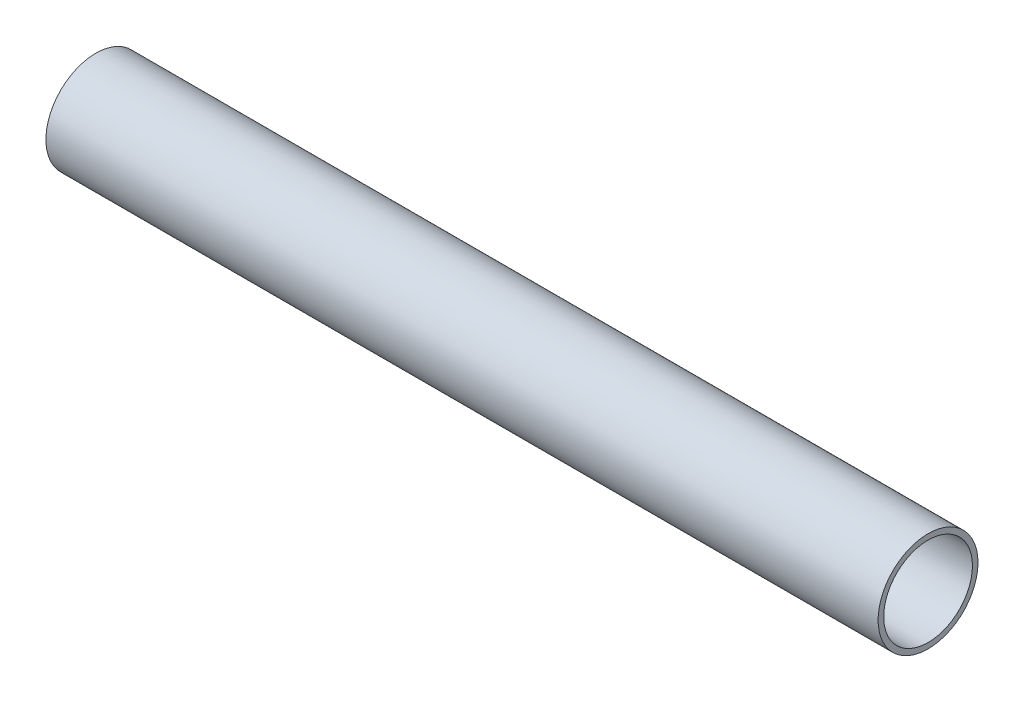
ISO-10303-21;
HEADER;
FILE_DESCRIPTION(('STEP AP214'),'2;1');
FILE_NAME('part.step','',(''),(''),'','','');
FILE_SCHEMA(('AUTOMOTIVE_DESIGN { 1 0 10303 214 1 1 1 1 }'));
ENDSEC;
DATA;
#1=APPLICATION_CONTEXT('core data for automotive mechanical design processes');
#2=APPLICATION_PROTOCOL_DEFINITION('international standard','automotive_design',2000,#1);
#3=PRODUCT_CONTEXT('',#1,'mechanical');
#4=PRODUCT('Part','Part','',(#3));
#5=PRODUCT_RELATED_PRODUCT_CATEGORY('part','',(#4));
#6=PRODUCT_DEFINITION_FORMATION('','',#4);
#7=PRODUCT_DEFINITION_CONTEXT('part definition',#1,'design');
#8=PRODUCT_DEFINITION('design','',#6,#7);
#9=PRODUCT_DEFINITION_SHAPE('','',#8);
#10=(LENGTH_UNIT() NAMED_UNIT(*) SI_UNIT(.MILLI.,.METRE.));
#11=(NAMED_UNIT(*) PLANE_ANGLE_UNIT() SI_UNIT($,.RADIAN.));
#12=(NAMED_UNIT(*) SI_UNIT($,.STERADIAN.) SOLID_ANGLE_UNIT());
#13=UNCERTAINTY_MEASURE_WITH_UNIT(LENGTH_MEASURE(1.E-05),#10,'distance_accuracy_value','');
#14=(GEOMETRIC_REPRESENTATION_CONTEXT(3) GLOBAL_UNCERTAINTY_ASSIGNED_CONTEXT((#13)) GLOBAL_UNIT_ASSIGNED_CONTEXT((#10,
#11,#12)) REPRESENTATION_CONTEXT('',''));
#15=CARTESIAN_POINT('',(0.,0.,0.));
#16=DIRECTION('',(0.,0.,1.));
#17=DIRECTION('',(1.,0.,0.));
#18=AXIS2_PLACEMENT_3D('',#15,#16,#17);
#19=CARTESIAN_POINT('',(150.,0.,0.));
#20=DIRECTION('',(1.,0.,0.));
#21=DIRECTION('',(0.,0.,-1.));
#22=AXIS2_PLACEMENT_3D('',#19,#20,#21);
#23=PLANE('',#22);
#24=CARTESIAN_POINT('',(150.,0.,0.));
#25=DIRECTION('',(1.,0.,0.));
#26=DIRECTION('',(0.,0.,-1.));
#27=AXIS2_PLACEMENT_3D('',#24,#25,#26);
#28=CIRCLE('',#27,9.);
#29=CARTESIAN_POINT('',(150.,0.,-9.));
#30=VERTEX_POINT('',#29);
#31=EDGE_CURVE('E10',#30,#30,#28,.T.);
#32=ORIENTED_EDGE('',*,*,#31,.T.);
#33=EDGE_LOOP('',(#32));
#34=FACE_BOUND('',#33,.T.);
#35=CARTESIAN_POINT('',(150.,0.,0.));
#36=DIRECTION('',(1.,0.,0.));
#37=DIRECTION('',(0.,0.,-1.));
#38=AXIS2_PLACEMENT_3D('',#35,#36,#37);
#39=CIRCLE('',#38,8.);
#40=CARTESIAN_POINT('',(150.,0.,-8.));
#41=VERTEX_POINT('',#40);
#42=EDGE_CURVE('E41',#41,#41,#39,.T.);
#43=ORIENTED_EDGE('',*,*,#42,.F.);
#44=EDGE_LOOP('',(#43));
#45=FACE_BOUND('',#44,.T.);
#46=ADVANCED_FACE('F30',(#34,#45),#23,.T.);
#47=CARTESIAN_POINT('',(0.,0.,0.));
#48=DIRECTION('',(1.,0.,0.));
#49=DIRECTION('',(0.,0.,-1.));
#50=AXIS2_PLACEMENT_3D('',#47,#48,#49);
#51=PLANE('',#50);
#52=CARTESIAN_POINT('',(0.,0.,0.));
#53=DIRECTION('',(1.,0.,0.));
#54=DIRECTION('',(0.,0.,-1.));
#55=AXIS2_PLACEMENT_3D('',#52,#53,#54);
#56=CIRCLE('',#55,9.);
#57=CARTESIAN_POINT('',(0.,0.,-9.));
#58=VERTEX_POINT('',#57);
#59=EDGE_CURVE('E34',#58,#58,#56,.T.);
#60=ORIENTED_EDGE('',*,*,#59,.F.);
#61=EDGE_LOOP('',(#60));
#62=FACE_BOUND('',#61,.T.);
#63=CARTESIAN_POINT('',(0.,0.,0.));
#64=DIRECTION('',(1.,0.,0.));
#65=DIRECTION('',(0.,0.,-1.));
#66=AXIS2_PLACEMENT_3D('',#63,#64,#65);
#67=CIRCLE('',#66,8.);
#68=CARTESIAN_POINT('',(0.,0.,-8.));
#69=VERTEX_POINT('',#68);
#70=EDGE_CURVE('E43',#69,#69,#67,.T.);
#71=ORIENTED_EDGE('',*,*,#70,.T.);
#72=EDGE_LOOP('',(#71));
#73=FACE_BOUND('',#72,.T.);
#74=ADVANCED_FACE('F53',(#62,#73),#51,.F.);
#75=CARTESIAN_POINT('',(150.,0.,0.));
#76=DIRECTION('',(-1.,0.,0.));
#77=DIRECTION('',(0.,0.,1.));
#78=AXIS2_PLACEMENT_3D('',#75,#76,#77);
#79=CYLINDRICAL_SURFACE('',#78,9.);
#80=ORIENTED_EDGE('',*,*,#31,.F.);
#81=EDGE_LOOP('',(#80));
#82=FACE_BOUND('',#81,.T.);
#83=ORIENTED_EDGE('',*,*,#59,.T.);
#84=EDGE_LOOP('',(#83));
#85=FACE_BOUND('',#84,.T.);
#86=ADVANCED_FACE('F32',(#82,#85),#79,.T.);
#87=CARTESIAN_POINT('',(150.,0.,0.));
#88=DIRECTION('',(-1.,0.,0.));
#89=DIRECTION('',(0.,0.,1.));
#90=AXIS2_PLACEMENT_3D('',#87,#88,#89);
#91=CYLINDRICAL_SURFACE('',#90,8.);
#92=ORIENTED_EDGE('',*,*,#42,.T.);
#93=EDGE_LOOP('',(#92));
#94=FACE_BOUND('',#93,.T.);
#95=ORIENTED_EDGE('',*,*,#70,.F.);
#96=EDGE_LOOP('',(#95));
#97=FACE_BOUND('',#96,.T.);
#98=ADVANCED_FACE('F49',(#94,#97),#91,.F.);
#99=CLOSED_SHELL('',(#46,#74,#86,#98));
#100=MANIFOLD_SOLID_BREP('B2',#99);
#101=ADVANCED_BREP_SHAPE_REPRESENTATION('',(#18,#100),#14);
#102=SHAPE_DEFINITION_REPRESENTATION(#9,#101);
ENDSEC;
END-ISO-10303-21;
